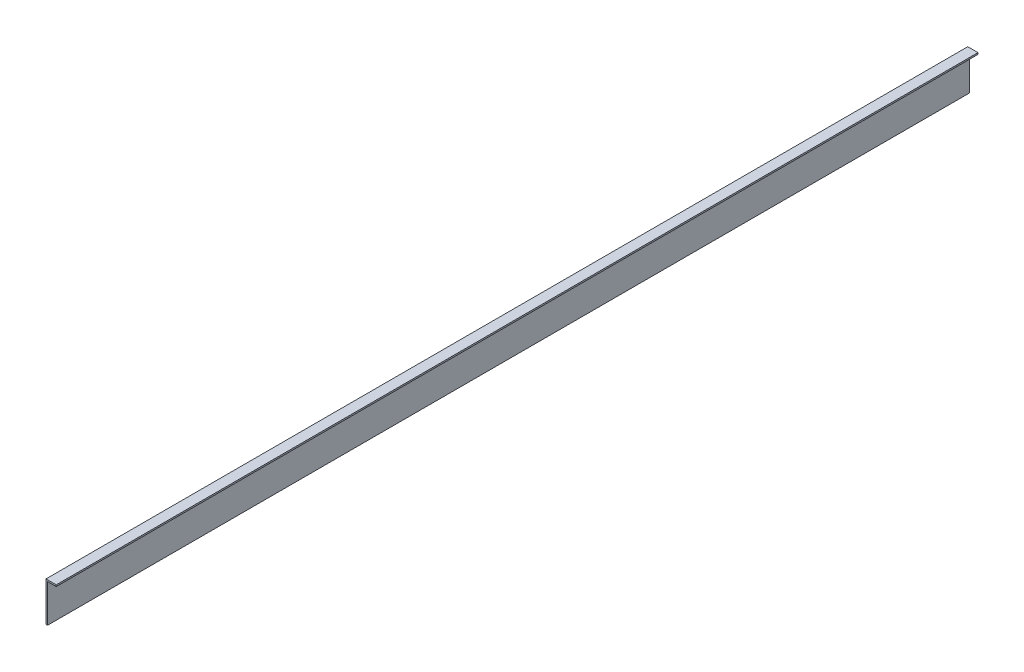
ISO-10303-21;
HEADER;
FILE_DESCRIPTION(('STEP AP214'),'2;1');
FILE_NAME('part.step','',(''),(''),'','','');
FILE_SCHEMA(('AUTOMOTIVE_DESIGN { 1 0 10303 214 1 1 1 1 }'));
ENDSEC;
DATA;
#1=APPLICATION_CONTEXT('core data for automotive mechanical design processes');
#2=APPLICATION_PROTOCOL_DEFINITION('international standard','automotive_design',2000,#1);
#3=PRODUCT_CONTEXT('',#1,'mechanical');
#4=PRODUCT('Part','Part','',(#3));
#5=PRODUCT_RELATED_PRODUCT_CATEGORY('part','',(#4));
#6=PRODUCT_DEFINITION_FORMATION('','',#4);
#7=PRODUCT_DEFINITION_CONTEXT('part definition',#1,'design');
#8=PRODUCT_DEFINITION('design','',#6,#7);
#9=PRODUCT_DEFINITION_SHAPE('','',#8);
#10=(LENGTH_UNIT() NAMED_UNIT(*) SI_UNIT(.MILLI.,.METRE.));
#11=(NAMED_UNIT(*) PLANE_ANGLE_UNIT() SI_UNIT($,.RADIAN.));
#12=(NAMED_UNIT(*) SI_UNIT($,.STERADIAN.) SOLID_ANGLE_UNIT());
#13=UNCERTAINTY_MEASURE_WITH_UNIT(LENGTH_MEASURE(1.E-05),#10,'distance_accuracy_value','');
#14=(GEOMETRIC_REPRESENTATION_CONTEXT(3) GLOBAL_UNCERTAINTY_ASSIGNED_CONTEXT((#13)) GLOBAL_UNIT_ASSIGNED_CONTEXT((#10,
#11,#12)) REPRESENTATION_CONTEXT('',''));
#15=CARTESIAN_POINT('',(0.,0.,0.));
#16=DIRECTION('',(0.,0.,1.));
#17=DIRECTION('',(1.,0.,0.));
#18=AXIS2_PLACEMENT_3D('',#15,#16,#17);
#19=CARTESIAN_POINT('',(1.5,0.,-900.));
#20=DIRECTION('',(0.,-1.,0.));
#21=DIRECTION('',(1.,0.,0.));
#22=AXIS2_PLACEMENT_3D('',#19,#20,#21);
#23=PLANE('',#22);
#24=DIRECTION('',(1.,0.,0.));
#25=VECTOR('',#24,1.);
#26=CARTESIAN_POINT('',(1.5,0.,0.));
#27=LINE('',#26,#25);
#28=CARTESIAN_POINT('',(0.,0.,0.));
#29=VERTEX_POINT('',#28);
#30=CARTESIAN_POINT('',(1.5,0.,0.));
#31=VERTEX_POINT('',#30);
#32=EDGE_CURVE('E117',#29,#31,#27,.T.);
#33=ORIENTED_EDGE('',*,*,#32,.F.);
#34=DIRECTION('',(0.,0.,1.));
#35=VECTOR('',#34,1.);
#36=CARTESIAN_POINT('',(0.,0.,-900.));
#37=LINE('',#36,#35);
#38=CARTESIAN_POINT('',(0.,0.,-900.));
#39=VERTEX_POINT('',#38);
#40=EDGE_CURVE('E11',#39,#29,#37,.T.);
#41=ORIENTED_EDGE('',*,*,#40,.F.);
#42=DIRECTION('',(1.,0.,0.));
#43=VECTOR('',#42,1.);
#44=CARTESIAN_POINT('',(1.5,0.,-900.));
#45=LINE('',#44,#43);
#46=CARTESIAN_POINT('',(1.5,0.,-900.));
#47=VERTEX_POINT('',#46);
#48=EDGE_CURVE('E131',#39,#47,#45,.T.);
#49=ORIENTED_EDGE('',*,*,#48,.T.);
#50=DIRECTION('',(0.,0.,1.));
#51=VECTOR('',#50,1.);
#52=CARTESIAN_POINT('',(1.5,0.,-900.));
#53=LINE('',#52,#51);
#54=EDGE_CURVE('E35',#47,#31,#53,.T.);
#55=ORIENTED_EDGE('',*,*,#54,.T.);
#56=EDGE_LOOP('',(#33,#41,#49,#55));
#57=FACE_BOUND('',#56,.T.);
#58=ADVANCED_FACE('F32',(#57),#23,.T.);
#59=CARTESIAN_POINT('',(0.,0.,-900.));
#60=DIRECTION('',(-1.,0.,0.));
#61=DIRECTION('',(0.,0.,1.));
#62=AXIS2_PLACEMENT_3D('',#59,#60,#61);
#63=PLANE('',#62);
#64=DIRECTION('',(0.,-1.,0.));
#65=VECTOR('',#64,1.);
#66=CARTESIAN_POINT('',(0.,0.,0.));
#67=LINE('',#66,#65);
#68=CARTESIAN_POINT('',(0.,38.5,0.));
#69=VERTEX_POINT('',#68);
#70=EDGE_CURVE('E129',#69,#29,#67,.T.);
#71=ORIENTED_EDGE('',*,*,#70,.F.);
#72=DIRECTION('',(0.,0.,1.));
#73=VECTOR('',#72,1.);
#74=CARTESIAN_POINT('',(0.,38.5,-900.));
#75=LINE('',#74,#73);
#76=CARTESIAN_POINT('',(0.,38.5,-900.));
#77=VERTEX_POINT('',#76);
#78=EDGE_CURVE('E41',#77,#69,#75,.T.);
#79=ORIENTED_EDGE('',*,*,#78,.F.);
#80=DIRECTION('',(0.,-1.,0.));
#81=VECTOR('',#80,1.);
#82=CARTESIAN_POINT('',(0.,0.,-900.));
#83=LINE('',#82,#81);
#84=EDGE_CURVE('E107',#77,#39,#83,.T.);
#85=ORIENTED_EDGE('',*,*,#84,.T.);
#86=ORIENTED_EDGE('',*,*,#40,.T.);
#87=EDGE_LOOP('',(#71,#79,#85,#86));
#88=FACE_BOUND('',#87,.T.);
#89=ADVANCED_FACE('F139',(#88),#63,.T.);
#90=CARTESIAN_POINT('',(0.,38.5,-900.));
#91=DIRECTION('',(0.,1.,0.));
#92=DIRECTION('',(-1.,0.,0.));
#93=AXIS2_PLACEMENT_3D('',#90,#91,#92);
#94=PLANE('',#93);
#95=DIRECTION('',(-1.,0.,0.));
#96=VECTOR('',#95,1.);
#97=CARTESIAN_POINT('',(0.,38.5,0.));
#98=LINE('',#97,#96);
#99=CARTESIAN_POINT('',(10.,38.5,0.));
#100=VERTEX_POINT('',#99);
#101=EDGE_CURVE('E94',#100,#69,#98,.T.);
#102=ORIENTED_EDGE('',*,*,#101,.F.);
#103=DIRECTION('',(0.,0.,1.));
#104=VECTOR('',#103,1.);
#105=CARTESIAN_POINT('',(10.,38.5,-900.));
#106=LINE('',#105,#104);
#107=CARTESIAN_POINT('',(10.,38.5,-900.));
#108=VERTEX_POINT('',#107);
#109=EDGE_CURVE('E89',#108,#100,#106,.T.);
#110=ORIENTED_EDGE('',*,*,#109,.F.);
#111=DIRECTION('',(-1.,0.,0.));
#112=VECTOR('',#111,1.);
#113=CARTESIAN_POINT('',(0.,38.5,-900.));
#114=LINE('',#113,#112);
#115=EDGE_CURVE('E92',#108,#77,#114,.T.);
#116=ORIENTED_EDGE('',*,*,#115,.T.);
#117=ORIENTED_EDGE('',*,*,#78,.T.);
#118=EDGE_LOOP('',(#102,#110,#116,#117));
#119=FACE_BOUND('',#118,.T.);
#120=ADVANCED_FACE('F91',(#119),#94,.T.);
#121=CARTESIAN_POINT('',(10.,38.5,-900.));
#122=DIRECTION('',(1.,0.,0.));
#123=DIRECTION('',(0.,0.,-1.));
#124=AXIS2_PLACEMENT_3D('',#121,#122,#123);
#125=PLANE('',#124);
#126=DIRECTION('',(0.,1.,0.));
#127=VECTOR('',#126,1.);
#128=CARTESIAN_POINT('',(10.,38.5,0.));
#129=LINE('',#128,#127);
#130=CARTESIAN_POINT('',(10.,37.,0.));
#131=VERTEX_POINT('',#130);
#132=EDGE_CURVE('E126',#131,#100,#129,.T.);
#133=ORIENTED_EDGE('',*,*,#132,.F.);
#134=DIRECTION('',(0.,0.,1.));
#135=VECTOR('',#134,1.);
#136=CARTESIAN_POINT('',(10.,37.,-900.));
#137=LINE('',#136,#135);
#138=CARTESIAN_POINT('',(10.,37.,-900.));
#139=VERTEX_POINT('',#138);
#140=EDGE_CURVE('E99',#139,#131,#137,.T.);
#141=ORIENTED_EDGE('',*,*,#140,.F.);
#142=DIRECTION('',(0.,1.,0.));
#143=VECTOR('',#142,1.);
#144=CARTESIAN_POINT('',(10.,38.5,-900.));
#145=LINE('',#144,#143);
#146=EDGE_CURVE('E105',#139,#108,#145,.T.);
#147=ORIENTED_EDGE('',*,*,#146,.T.);
#148=ORIENTED_EDGE('',*,*,#109,.T.);
#149=EDGE_LOOP('',(#133,#141,#147,#148));
#150=FACE_BOUND('',#149,.T.);
#151=ADVANCED_FACE('F109',(#150),#125,.T.);
#152=CARTESIAN_POINT('',(10.,37.,-900.));
#153=DIRECTION('',(0.,-1.,0.));
#154=DIRECTION('',(0.,0.,-1.));
#155=AXIS2_PLACEMENT_3D('',#152,#153,#154);
#156=PLANE('',#155);
#157=DIRECTION('',(1.,0.,0.));
#158=VECTOR('',#157,1.);
#159=CARTESIAN_POINT('',(10.,37.,0.));
#160=LINE('',#159,#158);
#161=CARTESIAN_POINT('',(1.49999999999999,37.,0.));
#162=VERTEX_POINT('',#161);
#163=EDGE_CURVE('E123',#162,#131,#160,.T.);
#164=ORIENTED_EDGE('',*,*,#163,.F.);
#165=DIRECTION('',(0.,0.,1.));
#166=VECTOR('',#165,1.);
#167=CARTESIAN_POINT('',(1.49999999999999,37.,-900.));
#168=LINE('',#167,#166);
#169=CARTESIAN_POINT('',(1.49999999999999,37.,-900.));
#170=VERTEX_POINT('',#169);
#171=EDGE_CURVE('E134',#170,#162,#168,.T.);
#172=ORIENTED_EDGE('',*,*,#171,.F.);
#173=DIRECTION('',(1.,0.,0.));
#174=VECTOR('',#173,1.);
#175=CARTESIAN_POINT('',(10.,37.,-900.));
#176=LINE('',#175,#174);
#177=EDGE_CURVE('E110',#170,#139,#176,.T.);
#178=ORIENTED_EDGE('',*,*,#177,.T.);
#179=ORIENTED_EDGE('',*,*,#140,.T.);
#180=EDGE_LOOP('',(#164,#172,#178,#179));
#181=FACE_BOUND('',#180,.T.);
#182=ADVANCED_FACE('F152',(#181),#156,.T.);
#183=CARTESIAN_POINT('',(1.49999999999999,37.,-900.));
#184=DIRECTION('',(1.,0.,0.));
#185=DIRECTION('',(0.,1.,0.));
#186=AXIS2_PLACEMENT_3D('',#183,#184,#185);
#187=PLANE('',#186);
#188=DIRECTION('',(0.,1.,0.));
#189=VECTOR('',#188,1.);
#190=CARTESIAN_POINT('',(1.49999999999999,37.,0.));
#191=LINE('',#190,#189);
#192=EDGE_CURVE('E120',#31,#162,#191,.T.);
#193=ORIENTED_EDGE('',*,*,#192,.F.);
#194=ORIENTED_EDGE('',*,*,#54,.F.);
#195=DIRECTION('',(0.,1.,0.));
#196=VECTOR('',#195,1.);
#197=CARTESIAN_POINT('',(1.49999999999999,37.,-900.));
#198=LINE('',#197,#196);
#199=EDGE_CURVE('E112',#47,#170,#198,.T.);
#200=ORIENTED_EDGE('',*,*,#199,.T.);
#201=ORIENTED_EDGE('',*,*,#171,.T.);
#202=EDGE_LOOP('',(#193,#194,#200,#201));
#203=FACE_BOUND('',#202,.T.);
#204=ADVANCED_FACE('F136',(#203),#187,.T.);
#205=CARTESIAN_POINT('',(0.,0.,-900.));
#206=DIRECTION('',(0.,0.,-1.));
#207=DIRECTION('',(-1.,0.,0.));
#208=AXIS2_PLACEMENT_3D('',#205,#206,#207);
#209=PLANE('',#208);
#210=ORIENTED_EDGE('',*,*,#48,.F.);
#211=ORIENTED_EDGE('',*,*,#84,.F.);
#212=ORIENTED_EDGE('',*,*,#115,.F.);
#213=ORIENTED_EDGE('',*,*,#146,.F.);
#214=ORIENTED_EDGE('',*,*,#177,.F.);
#215=ORIENTED_EDGE('',*,*,#199,.F.);
#216=EDGE_LOOP('',(#210,#211,#212,#213,#214,#215));
#217=FACE_BOUND('',#216,.T.);
#218=ADVANCED_FACE('F103',(#217),#209,.T.);
#219=CARTESIAN_POINT('',(0.,0.,0.));
#220=DIRECTION('',(0.,0.,-1.));
#221=DIRECTION('',(-1.,0.,0.));
#222=AXIS2_PLACEMENT_3D('',#219,#220,#221);
#223=PLANE('',#222);
#224=ORIENTED_EDGE('',*,*,#32,.T.);
#225=ORIENTED_EDGE('',*,*,#192,.T.);
#226=ORIENTED_EDGE('',*,*,#163,.T.);
#227=ORIENTED_EDGE('',*,*,#132,.T.);
#228=ORIENTED_EDGE('',*,*,#101,.T.);
#229=ORIENTED_EDGE('',*,*,#70,.T.);
#230=EDGE_LOOP('',(#224,#225,#226,#227,#228,#229));
#231=FACE_BOUND('',#230,.T.);
#232=ADVANCED_FACE('F138',(#231),#223,.F.);
#233=CLOSED_SHELL('',(#58,#89,#120,#151,#182,#204,#218,#232));
#234=MANIFOLD_SOLID_BREP('B2',#233);
#235=ADVANCED_BREP_SHAPE_REPRESENTATION('',(#18,#234),#14);
#236=SHAPE_DEFINITION_REPRESENTATION(#9,#235);
ENDSEC;
END-ISO-10303-21;
